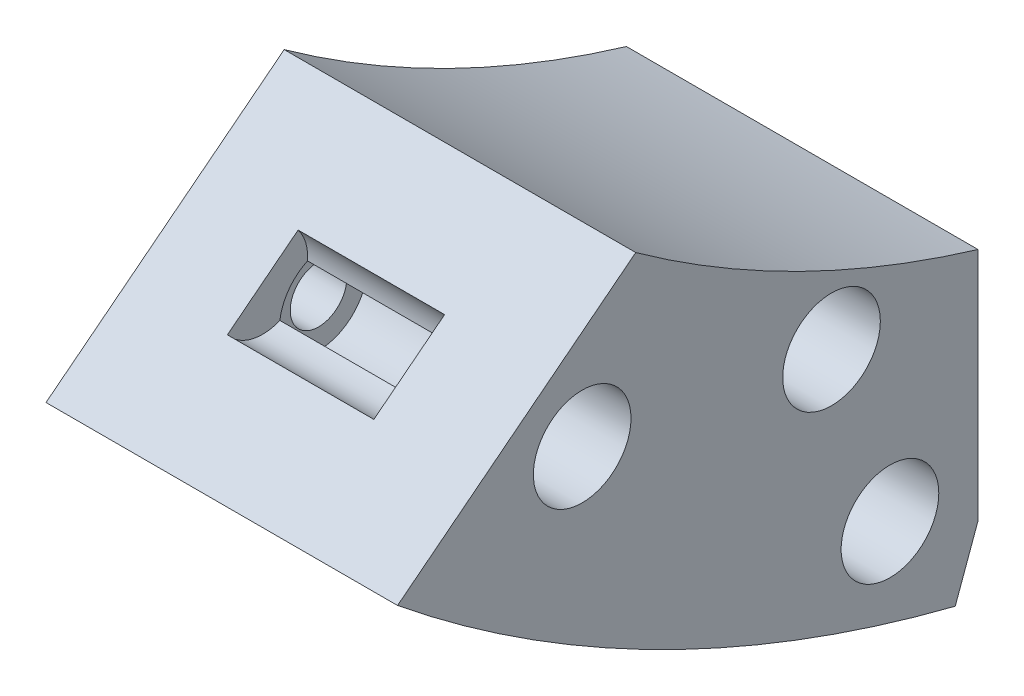
ISO-10303-21;
HEADER;
FILE_DESCRIPTION(('STEP AP214'),'2;1');
FILE_NAME('part.step','',(''),(''),'','','');
FILE_SCHEMA(('AUTOMOTIVE_DESIGN { 1 0 10303 214 1 1 1 1 }'));
ENDSEC;
DATA;
#1=APPLICATION_CONTEXT('core data for automotive mechanical design processes');
#2=APPLICATION_PROTOCOL_DEFINITION('international standard','automotive_design',2000,#1);
#3=PRODUCT_CONTEXT('',#1,'mechanical');
#4=PRODUCT('Part','Part','',(#3));
#5=PRODUCT_RELATED_PRODUCT_CATEGORY('part','',(#4));
#6=PRODUCT_DEFINITION_FORMATION('','',#4);
#7=PRODUCT_DEFINITION_CONTEXT('part definition',#1,'design');
#8=PRODUCT_DEFINITION('design','',#6,#7);
#9=PRODUCT_DEFINITION_SHAPE('','',#8);
#10=(LENGTH_UNIT() NAMED_UNIT(*) SI_UNIT(.MILLI.,.METRE.));
#11=(NAMED_UNIT(*) PLANE_ANGLE_UNIT() SI_UNIT($,.RADIAN.));
#12=(NAMED_UNIT(*) SI_UNIT($,.STERADIAN.) SOLID_ANGLE_UNIT());
#13=UNCERTAINTY_MEASURE_WITH_UNIT(LENGTH_MEASURE(1.E-05),#10,'distance_accuracy_value','');
#14=(GEOMETRIC_REPRESENTATION_CONTEXT(3) GLOBAL_UNCERTAINTY_ASSIGNED_CONTEXT((#13)) GLOBAL_UNIT_ASSIGNED_CONTEXT((#10,
#11,#12)) REPRESENTATION_CONTEXT('',''));
#15=CARTESIAN_POINT('',(0.,0.,0.));
#16=DIRECTION('',(0.,0.,1.));
#17=DIRECTION('',(1.,0.,0.));
#18=AXIS2_PLACEMENT_3D('',#15,#16,#17);
#19=CARTESIAN_POINT('',(12.5,-1.51980484451966,40.6917055770045));
#20=DIRECTION('',(-1.,0.,0.));
#21=DIRECTION('',(0.,0.,1.));
#22=AXIS2_PLACEMENT_3D('',#19,#20,#21);
#23=CYLINDRICAL_SURFACE('',#22,2.3);
#24=DIRECTION('',(1.,0.,0.));
#25=VECTOR('',#24,1.);
#26=CARTESIAN_POINT('',(11.25,-3.64574234379516,39.8139870861578));
#27=LINE('',#26,#25);
#28=CARTESIAN_POINT('',(5.,-3.64574234379516,39.8139870861578));
#29=VERTEX_POINT('',#28);
#30=CARTESIAN_POINT('',(12.5,-3.64574234379516,39.8139870861578));
#31=VERTEX_POINT('',#30);
#32=EDGE_CURVE('E11',#29,#31,#27,.T.);
#33=ORIENTED_EDGE('',*,*,#32,.F.);
#34=CARTESIAN_POINT('',(5.,-1.51980484451966,40.6917055770045));
#35=DIRECTION('',(1.,0.,0.));
#36=DIRECTION('',(0.,0.,-1.));
#37=AXIS2_PLACEMENT_3D('',#34,#35,#36);
#38=CIRCLE('',#37,2.3);
#39=CARTESIAN_POINT('',(5.,-2.93803947495611,42.5023989616035));
#40=VERTEX_POINT('',#39);
#41=EDGE_CURVE('E204',#40,#29,#38,.T.);
#42=ORIENTED_EDGE('',*,*,#41,.F.);
#43=DIRECTION('',(-1.,0.,0.));
#44=VECTOR('',#43,1.);
#45=CARTESIAN_POINT('',(12.5,-2.93803947495611,42.5023989616035));
#46=LINE('',#45,#44);
#47=CARTESIAN_POINT('',(12.5,-2.93803947495611,42.5023989616035));
#48=VERTEX_POINT('',#47);
#49=EDGE_CURVE('E166',#48,#40,#46,.T.);
#50=ORIENTED_EDGE('',*,*,#49,.F.);
#51=CARTESIAN_POINT('',(12.5,-1.51980484451966,40.6917055770045));
#52=DIRECTION('',(1.,0.,0.));
#53=DIRECTION('',(0.,0.,-1.));
#54=AXIS2_PLACEMENT_3D('',#51,#52,#53);
#55=CIRCLE('',#54,2.3);
#56=EDGE_CURVE('E215',#48,#31,#55,.T.);
#57=ORIENTED_EDGE('',*,*,#56,.T.);
#58=EDGE_LOOP('',(#33,#42,#50,#57));
#59=FACE_BOUND('',#58,.T.);
#60=ADVANCED_FACE('F43',(#59),#23,.F.);
#61=CARTESIAN_POINT('',(5.,3.44990452796305,9.47853478985269));
#62=DIRECTION('',(0.,-0.34202014332567,-0.939692620785908));
#63=DIRECTION('',(0.,0.939692620785908,-0.34202014332567));
#64=AXIS2_PLACEMENT_3D('',#61,#62,#63);
#65=PLANE('',#64);
#66=DIRECTION('',(0.,-0.939692620785908,0.34202014332567));
#67=VECTOR('',#66,1.);
#68=CARTESIAN_POINT('',(0.,3.44990452796305,9.47853478985269));
#69=LINE('',#68,#67);
#70=CARTESIAN_POINT('',(0.,-17.4044108827094,17.0688848553364));
#71=VERTEX_POINT('',#70);
#72=CARTESIAN_POINT('',(0.,-20.6071995803838,18.2346046079341));
#73=VERTEX_POINT('',#72);
#74=EDGE_CURVE('E131',#71,#73,#69,.T.);
#75=ORIENTED_EDGE('',*,*,#74,.F.);
#76=DIRECTION('',(-1.,0.,0.));
#77=VECTOR('',#76,1.);
#78=CARTESIAN_POINT('',(18.,-17.4044108827094,17.0688848553364));
#79=LINE('',#78,#77);
#80=CARTESIAN_POINT('',(18.,-17.4044108827094,17.0688848553364));
#81=VERTEX_POINT('',#80);
#82=EDGE_CURVE('E233',#81,#71,#79,.T.);
#83=ORIENTED_EDGE('',*,*,#82,.F.);
#84=DIRECTION('',(0.,0.939692620785908,-0.34202014332567));
#85=VECTOR('',#84,1.);
#86=CARTESIAN_POINT('',(18.,3.44990452796305,9.47853478985269));
#87=LINE('',#86,#85);
#88=CARTESIAN_POINT('',(18.,-20.6071995803838,18.2346046079342));
#89=VERTEX_POINT('',#88);
#90=EDGE_CURVE('E139',#89,#81,#87,.T.);
#91=ORIENTED_EDGE('',*,*,#90,.F.);
#92=DIRECTION('',(-1.,0.,0.));
#93=VECTOR('',#92,1.);
#94=CARTESIAN_POINT('',(5.,-20.6071995803838,18.2346046079341));
#95=LINE('',#94,#93);
#96=EDGE_CURVE('E142',#89,#73,#95,.T.);
#97=ORIENTED_EDGE('',*,*,#96,.T.);
#98=EDGE_LOOP('',(#75,#83,#91,#97));
#99=FACE_BOUND('',#98,.T.);
#100=ADVANCED_FACE('F45',(#99),#65,.T.);
#101=CARTESIAN_POINT('',(5.,51.4204978338215,0.));
#102=DIRECTION('',(-1.,0.,0.));
#103=DIRECTION('',(0.,0.,1.));
#104=AXIS2_PLACEMENT_3D('',#101,#102,#103);
#105=CYLINDRICAL_SURFACE('',#104,59.3);
#106=CARTESIAN_POINT('',(0.,51.4204978338215,0.));
#107=DIRECTION('',(1.,0.,0.));
#108=DIRECTION('',(0.,0.,-1.));
#109=AXIS2_PLACEMENT_3D('',#106,#107,#108);
#110=CIRCLE('',#109,59.3);
#111=CARTESIAN_POINT('',(0.,-5.3698461499516,17.0688848553364));
#112=VERTEX_POINT('',#111);
#113=CARTESIAN_POINT('',(0.,3.25652029388745,34.5936593544646));
#114=VERTEX_POINT('',#113);
#115=EDGE_CURVE('E91',#112,#114,#110,.F.);
#116=ORIENTED_EDGE('',*,*,#115,.T.);
#117=DIRECTION('',(-1.,0.,0.));
#118=VECTOR('',#117,1.);
#119=CARTESIAN_POINT('',(5.,3.25652029388745,34.5936593544646));
#120=LINE('',#119,#118);
#121=CARTESIAN_POINT('',(18.,3.25652029388745,34.5936593544646));
#122=VERTEX_POINT('',#121);
#123=EDGE_CURVE('E159',#122,#114,#120,.T.);
#124=ORIENTED_EDGE('',*,*,#123,.F.);
#125=CARTESIAN_POINT('',(18.,51.4204978338215,0.));
#126=DIRECTION('',(1.,0.,0.));
#127=DIRECTION('',(0.,0.,-1.));
#128=AXIS2_PLACEMENT_3D('',#125,#126,#127);
#129=CIRCLE('',#128,59.3);
#130=CARTESIAN_POINT('',(18.,-5.3698461499516,17.0688848553364));
#131=VERTEX_POINT('',#130);
#132=EDGE_CURVE('E73',#122,#131,#129,.T.);
#133=ORIENTED_EDGE('',*,*,#132,.T.);
#134=DIRECTION('',(-1.,0.,0.));
#135=VECTOR('',#134,1.);
#136=CARTESIAN_POINT('',(18.,-5.3698461499516,17.0688848553364));
#137=LINE('',#136,#135);
#138=EDGE_CURVE('E182',#131,#112,#137,.T.);
#139=ORIENTED_EDGE('',*,*,#138,.T.);
#140=EDGE_LOOP('',(#116,#124,#133,#139));
#141=FACE_BOUND('',#140,.T.);
#142=ADVANCED_FACE('F231',(#141),#105,.F.);
#143=CARTESIAN_POINT('',(5.,18.8115247673315,14.7342206600315));
#144=DIRECTION('',(0.,0.787257993303946,0.616623752363663));
#145=DIRECTION('',(0.,-0.616623752363663,0.787257993303946));
#146=AXIS2_PLACEMENT_3D('',#143,#144,#145);
#147=PLANE('',#146);
#148=DIRECTION('',(0.,0.616623752363663,-0.787257993303946));
#149=VECTOR('',#148,1.);
#150=CARTESIAN_POINT('',(12.5,18.8115247673315,14.7342206600315));
#151=LINE('',#150,#149);
#152=CARTESIAN_POINT('',(12.5,-0.101570214083261,38.8810121924054));
#153=VERTEX_POINT('',#152);
#154=EDGE_CURVE('E174',#48,#153,#151,.T.);
#155=ORIENTED_EDGE('',*,*,#154,.F.);
#156=ORIENTED_EDGE('',*,*,#49,.T.);
#157=DIRECTION('',(0.,0.616623752363663,-0.787257993303946));
#158=VECTOR('',#157,1.);
#159=CARTESIAN_POINT('',(5.,18.8115247673315,14.7342206600315));
#160=LINE('',#159,#158);
#161=CARTESIAN_POINT('',(5.,-0.101570214083261,38.8810121924054));
#162=VERTEX_POINT('',#161);
#163=EDGE_CURVE('E162',#40,#162,#160,.T.);
#164=ORIENTED_EDGE('',*,*,#163,.T.);
#165=DIRECTION('',(-1.,0.,0.));
#166=VECTOR('',#165,1.);
#167=CARTESIAN_POINT('',(12.5,-0.101570214083261,38.8810121924054));
#168=LINE('',#167,#166);
#169=EDGE_CURVE('E170',#162,#153,#168,.F.);
#170=ORIENTED_EDGE('',*,*,#169,.T.);
#171=EDGE_LOOP('',(#155,#156,#164,#170));
#172=FACE_BOUND('',#171,.T.);
#173=DIRECTION('',(0.,0.616623752363663,-0.787257993303946));
#174=VECTOR('',#173,1.);
#175=CARTESIAN_POINT('',(0.,18.8115247673315,14.7342206600315));
#176=LINE('',#175,#174);
#177=CARTESIAN_POINT('',(0.,-6.29612998292682,46.7897517995443));
#178=VERTEX_POINT('',#177);
#179=EDGE_CURVE('E152',#178,#114,#176,.T.);
#180=ORIENTED_EDGE('',*,*,#179,.F.);
#181=DIRECTION('',(-1.,0.,0.));
#182=VECTOR('',#181,1.);
#183=CARTESIAN_POINT('',(5.,-6.29612998292682,46.7897517995443));
#184=LINE('',#183,#182);
#185=CARTESIAN_POINT('',(18.,-6.29612998292677,46.7897517995444));
#186=VERTEX_POINT('',#185);
#187=EDGE_CURVE('E147',#186,#178,#184,.T.);
#188=ORIENTED_EDGE('',*,*,#187,.F.);
#189=DIRECTION('',(0.,-0.616623752363663,0.787257993303946));
#190=VECTOR('',#189,1.);
#191=CARTESIAN_POINT('',(18.,18.8115247673315,14.7342206600315));
#192=LINE('',#191,#190);
#193=EDGE_CURVE('E219',#122,#186,#192,.T.);
#194=ORIENTED_EDGE('',*,*,#193,.F.);
#195=ORIENTED_EDGE('',*,*,#123,.T.);
#196=EDGE_LOOP('',(#180,#188,#194,#195));
#197=FACE_BOUND('',#196,.T.);
#198=ADVANCED_FACE('F230',(#172,#197),#147,.T.);
#199=CARTESIAN_POINT('',(5.,51.4204978338215,0.));
#200=DIRECTION('',(-1.,0.,0.));
#201=DIRECTION('',(0.,0.,1.));
#202=AXIS2_PLACEMENT_3D('',#199,#200,#201);
#203=CYLINDRICAL_SURFACE('',#202,74.3);
#204=CARTESIAN_POINT('',(0.,51.4204978338215,0.));
#205=DIRECTION('',(1.,0.,0.));
#206=DIRECTION('',(0.,0.,-1.));
#207=AXIS2_PLACEMENT_3D('',#204,#205,#206);
#208=CIRCLE('',#207,74.3);
#209=EDGE_CURVE('E135',#73,#178,#208,.F.);
#210=ORIENTED_EDGE('',*,*,#209,.F.);
#211=ORIENTED_EDGE('',*,*,#96,.F.);
#212=CARTESIAN_POINT('',(18.,51.4204978338215,0.));
#213=DIRECTION('',(1.,0.,0.));
#214=DIRECTION('',(0.,0.,-1.));
#215=AXIS2_PLACEMENT_3D('',#212,#213,#214);
#216=CIRCLE('',#215,74.3);
#217=EDGE_CURVE('E223',#186,#89,#216,.T.);
#218=ORIENTED_EDGE('',*,*,#217,.F.);
#219=ORIENTED_EDGE('',*,*,#187,.T.);
#220=EDGE_LOOP('',(#210,#211,#218,#219));
#221=FACE_BOUND('',#220,.T.);
#222=ADVANCED_FACE('F149',(#221),#203,.T.);
#223=CARTESIAN_POINT('',(0.,0.,0.));
#224=DIRECTION('',(1.,0.,0.));
#225=DIRECTION('',(0.,0.,-1.));
#226=AXIS2_PLACEMENT_3D('',#223,#224,#225);
#227=PLANE('',#226);
#228=CARTESIAN_POINT('',(0.,-3.97184686974396,37.3353471691558));
#229=DIRECTION('',(1.,0.,0.));
#230=DIRECTION('',(0.,0.,-1.));
#231=AXIS2_PLACEMENT_3D('',#228,#229,#230);
#232=CIRCLE('',#231,1.45);
#233=CARTESIAN_POINT('',(0.,-3.97184686974396,35.8853471691558));
#234=VERTEX_POINT('',#233);
#235=EDGE_CURVE('E271',#234,#234,#232,.T.);
#236=ORIENTED_EDGE('',*,*,#235,.T.);
#237=EDGE_LOOP('',(#236));
#238=FACE_BOUND('',#237,.T.);
#239=CARTESIAN_POINT('',(0.,-6.04792738355526,24.5688848553364));
#240=DIRECTION('',(1.,0.,0.));
#241=DIRECTION('',(0.,0.,-1.));
#242=AXIS2_PLACEMENT_3D('',#239,#240,#241);
#243=CIRCLE('',#242,1.45);
#244=CARTESIAN_POINT('',(0.,-6.04792738355526,23.1188848553364));
#245=VERTEX_POINT('',#244);
#246=EDGE_CURVE('E254',#245,#245,#243,.T.);
#247=ORIENTED_EDGE('',*,*,#246,.T.);
#248=EDGE_LOOP('',(#247));
#249=FACE_BOUND('',#248,.T.);
#250=CARTESIAN_POINT('',(0.,-15.1710720304473,21.5769048524624));
#251=DIRECTION('',(1.,0.,0.));
#252=DIRECTION('',(0.,0.,-1.));
#253=AXIS2_PLACEMENT_3D('',#250,#251,#252);
#254=CIRCLE('',#253,1.45);
#255=CARTESIAN_POINT('',(0.,-15.1710720304473,20.1269048524624));
#256=VERTEX_POINT('',#255);
#257=EDGE_CURVE('E237',#256,#256,#254,.T.);
#258=ORIENTED_EDGE('',*,*,#257,.T.);
#259=EDGE_LOOP('',(#258));
#260=FACE_BOUND('',#259,.T.);
#261=ORIENTED_EDGE('',*,*,#115,.F.);
#262=DIRECTION('',(0.,1.,0.));
#263=VECTOR('',#262,1.);
#264=CARTESIAN_POINT('',(0.,0.,17.0688848553364));
#265=LINE('',#264,#263);
#266=EDGE_CURVE('E137',#112,#71,#265,.F.);
#267=ORIENTED_EDGE('',*,*,#266,.T.);
#268=ORIENTED_EDGE('',*,*,#74,.T.);
#269=ORIENTED_EDGE('',*,*,#209,.T.);
#270=ORIENTED_EDGE('',*,*,#179,.T.);
#271=EDGE_LOOP('',(#261,#267,#268,#269,#270));
#272=FACE_BOUND('',#271,.T.);
#273=ADVANCED_FACE('F133',(#238,#249,#260,#272),#227,.F.);
#274=CARTESIAN_POINT('',(18.,0.,0.));
#275=DIRECTION('',(1.,0.,0.));
#276=DIRECTION('',(0.,0.,-1.));
#277=AXIS2_PLACEMENT_3D('',#274,#275,#276);
#278=PLANE('',#277);
#279=CARTESIAN_POINT('',(18.,-3.97184686974396,37.3353471691558));
#280=DIRECTION('',(1.,0.,0.));
#281=DIRECTION('',(0.,0.,-1.));
#282=AXIS2_PLACEMENT_3D('',#279,#280,#281);
#283=CIRCLE('',#282,2.5);
#284=CARTESIAN_POINT('',(18.,-3.97184686974396,34.8353471691558));
#285=VERTEX_POINT('',#284);
#286=EDGE_CURVE('E283',#285,#285,#283,.T.);
#287=ORIENTED_EDGE('',*,*,#286,.F.);
#288=EDGE_LOOP('',(#287));
#289=FACE_BOUND('',#288,.T.);
#290=CARTESIAN_POINT('',(18.,-6.04792738355526,24.5688848553364));
#291=DIRECTION('',(1.,0.,0.));
#292=DIRECTION('',(0.,0.,-1.));
#293=AXIS2_PLACEMENT_3D('',#290,#291,#292);
#294=CIRCLE('',#293,2.5);
#295=CARTESIAN_POINT('',(18.,-6.04792738355526,22.0688848553364));
#296=VERTEX_POINT('',#295);
#297=EDGE_CURVE('E206',#296,#296,#294,.T.);
#298=ORIENTED_EDGE('',*,*,#297,.F.);
#299=EDGE_LOOP('',(#298));
#300=FACE_BOUND('',#299,.T.);
#301=CARTESIAN_POINT('',(18.,-15.1710720304473,21.5769048524624));
#302=DIRECTION('',(1.,0.,0.));
#303=DIRECTION('',(0.,0.,-1.));
#304=AXIS2_PLACEMENT_3D('',#301,#302,#303);
#305=CIRCLE('',#304,2.5);
#306=CARTESIAN_POINT('',(18.,-15.1710720304473,19.0769048524624));
#307=VERTEX_POINT('',#306);
#308=EDGE_CURVE('E251',#307,#307,#305,.T.);
#309=ORIENTED_EDGE('',*,*,#308,.F.);
#310=EDGE_LOOP('',(#309));
#311=FACE_BOUND('',#310,.T.);
#312=DIRECTION('',(0.,-1.,0.));
#313=VECTOR('',#312,1.);
#314=CARTESIAN_POINT('',(18.,0.,17.0688848553364));
#315=LINE('',#314,#313);
#316=EDGE_CURVE('E97',#131,#81,#315,.T.);
#317=ORIENTED_EDGE('',*,*,#316,.F.);
#318=ORIENTED_EDGE('',*,*,#132,.F.);
#319=ORIENTED_EDGE('',*,*,#193,.T.);
#320=ORIENTED_EDGE('',*,*,#217,.T.);
#321=ORIENTED_EDGE('',*,*,#90,.T.);
#322=EDGE_LOOP('',(#317,#318,#319,#320,#321));
#323=FACE_BOUND('',#322,.T.);
#324=ADVANCED_FACE('F227',(#289,#300,#311,#323),#278,.T.);
#325=DIRECTION('',(1.,0.,0.));
#326=VECTOR('',#325,1.);
#327=CARTESIAN_POINT('',(11.25,-1.70966629971349,38.3995553577056));
#328=LINE('',#327,#326);
#329=CARTESIAN_POINT('',(12.5,-1.70966629971349,38.3995553577056));
#330=VERTEX_POINT('',#329);
#331=CARTESIAN_POINT('',(5.,-1.70966629971349,38.3995553577056));
#332=VERTEX_POINT('',#331);
#333=EDGE_CURVE('E52',#330,#332,#328,.F.);
#334=ORIENTED_EDGE('',*,*,#333,.F.);
#335=EDGE_CURVE('E212',#330,#153,#55,.T.);
#336=ORIENTED_EDGE('',*,*,#335,.T.);
#337=ORIENTED_EDGE('',*,*,#169,.F.);
#338=EDGE_CURVE('E181',#332,#162,#38,.T.);
#339=ORIENTED_EDGE('',*,*,#338,.F.);
#340=EDGE_LOOP('',(#334,#336,#337,#339));
#341=FACE_BOUND('',#340,.T.);
#342=ADVANCED_FACE('F208',(#341),#23,.F.);
#343=CARTESIAN_POINT('',(12.5,-1.51980484451966,40.6917055770045));
#344=DIRECTION('',(1.,0.,0.));
#345=DIRECTION('',(0.,0.,-1.));
#346=AXIS2_PLACEMENT_3D('',#343,#344,#345);
#347=PLANE('',#346);
#348=ORIENTED_EDGE('',*,*,#335,.F.);
#349=CARTESIAN_POINT('',(12.5,-3.97184686974396,37.3353471691558));
#350=DIRECTION('',(1.,0.,0.));
#351=DIRECTION('',(0.,0.,-1.));
#352=AXIS2_PLACEMENT_3D('',#349,#350,#351);
#353=CIRCLE('',#352,2.5);
#354=EDGE_CURVE('E61',#330,#31,#353,.T.);
#355=ORIENTED_EDGE('',*,*,#354,.T.);
#356=ORIENTED_EDGE('',*,*,#56,.F.);
#357=ORIENTED_EDGE('',*,*,#154,.T.);
#358=EDGE_LOOP('',(#348,#355,#356,#357));
#359=FACE_BOUND('',#358,.T.);
#360=ADVANCED_FACE('F320',(#359),#347,.F.);
#361=CARTESIAN_POINT('',(5.,-1.51980484451966,40.6917055770045));
#362=DIRECTION('',(1.,0.,0.));
#363=DIRECTION('',(0.,0.,-1.));
#364=AXIS2_PLACEMENT_3D('',#361,#362,#363);
#365=PLANE('',#364);
#366=CARTESIAN_POINT('',(5.,-3.97184686974396,37.3353471691558));
#367=DIRECTION('',(1.,0.,0.));
#368=DIRECTION('',(0.,0.,-1.));
#369=AXIS2_PLACEMENT_3D('',#366,#367,#368);
#370=CIRCLE('',#369,2.5);
#371=EDGE_CURVE('E191',#332,#29,#370,.T.);
#372=ORIENTED_EDGE('',*,*,#371,.F.);
#373=ORIENTED_EDGE('',*,*,#338,.T.);
#374=ORIENTED_EDGE('',*,*,#163,.F.);
#375=ORIENTED_EDGE('',*,*,#41,.T.);
#376=EDGE_LOOP('',(#372,#373,#374,#375));
#377=FACE_BOUND('',#376,.T.);
#378=ADVANCED_FACE('F201',(#377),#365,.T.);
#379=CARTESIAN_POINT('',(18.,0.,17.0688848553364));
#380=DIRECTION('',(0.,0.,-1.));
#381=DIRECTION('',(0.,1.,0.));
#382=AXIS2_PLACEMENT_3D('',#379,#380,#381);
#383=PLANE('',#382);
#384=ORIENTED_EDGE('',*,*,#266,.F.);
#385=ORIENTED_EDGE('',*,*,#138,.F.);
#386=ORIENTED_EDGE('',*,*,#316,.T.);
#387=ORIENTED_EDGE('',*,*,#82,.T.);
#388=EDGE_LOOP('',(#384,#385,#386,#387));
#389=FACE_BOUND('',#388,.T.);
#390=ADVANCED_FACE('F235',(#389),#383,.T.);
#391=CARTESIAN_POINT('',(18.,-15.1710720304473,21.5769048524624));
#392=DIRECTION('',(1.,0.,0.));
#393=DIRECTION('',(0.,0.,-1.));
#394=AXIS2_PLACEMENT_3D('',#391,#392,#393);
#395=CYLINDRICAL_SURFACE('',#394,1.45);
#396=ORIENTED_EDGE('',*,*,#257,.F.);
#397=EDGE_LOOP('',(#396));
#398=FACE_BOUND('',#397,.T.);
#399=CARTESIAN_POINT('',(4.5,-15.1710720304473,21.5769048524624));
#400=DIRECTION('',(1.,0.,0.));
#401=DIRECTION('',(0.,0.,-1.));
#402=AXIS2_PLACEMENT_3D('',#399,#400,#401);
#403=CIRCLE('',#402,1.45);
#404=CARTESIAN_POINT('',(4.5,-15.1710720304473,20.1269048524624));
#405=VERTEX_POINT('',#404);
#406=EDGE_CURVE('E243',#405,#405,#403,.T.);
#407=ORIENTED_EDGE('',*,*,#406,.T.);
#408=EDGE_LOOP('',(#407));
#409=FACE_BOUND('',#408,.T.);
#410=ADVANCED_FACE('F308',(#398,#409),#395,.F.);
#411=CARTESIAN_POINT('',(4.5,-13.7210720304473,21.5769048524624));
#412=DIRECTION('',(-1.,0.,0.));
#413=DIRECTION('',(0.,0.,1.));
#414=AXIS2_PLACEMENT_3D('',#411,#412,#413);
#415=PLANE('',#414);
#416=ORIENTED_EDGE('',*,*,#406,.F.);
#417=EDGE_LOOP('',(#416));
#418=FACE_BOUND('',#417,.T.);
#419=CARTESIAN_POINT('',(4.5,-15.1710720304473,21.5769048524624));
#420=DIRECTION('',(1.,0.,0.));
#421=DIRECTION('',(0.,0.,-1.));
#422=AXIS2_PLACEMENT_3D('',#419,#420,#421);
#423=CIRCLE('',#422,2.5);
#424=CARTESIAN_POINT('',(4.5,-15.1710720304473,19.0769048524624));
#425=VERTEX_POINT('',#424);
#426=EDGE_CURVE('E247',#425,#425,#423,.T.);
#427=ORIENTED_EDGE('',*,*,#426,.T.);
#428=EDGE_LOOP('',(#427));
#429=FACE_BOUND('',#428,.T.);
#430=ADVANCED_FACE('F298',(#418,#429),#415,.F.);
#431=CARTESIAN_POINT('',(18.,-15.1710720304473,21.5769048524624));
#432=DIRECTION('',(1.,0.,0.));
#433=DIRECTION('',(0.,0.,-1.));
#434=AXIS2_PLACEMENT_3D('',#431,#432,#433);
#435=CYLINDRICAL_SURFACE('',#434,2.5);
#436=ORIENTED_EDGE('',*,*,#426,.F.);
#437=EDGE_LOOP('',(#436));
#438=FACE_BOUND('',#437,.T.);
#439=ORIENTED_EDGE('',*,*,#308,.T.);
#440=EDGE_LOOP('',(#439));
#441=FACE_BOUND('',#440,.T.);
#442=ADVANCED_FACE('F295',(#438,#441),#435,.F.);
#443=CARTESIAN_POINT('',(18.,-6.04792738355526,24.5688848553364));
#444=DIRECTION('',(1.,0.,0.));
#445=DIRECTION('',(0.,0.,-1.));
#446=AXIS2_PLACEMENT_3D('',#443,#444,#445);
#447=CYLINDRICAL_SURFACE('',#446,1.45);
#448=ORIENTED_EDGE('',*,*,#246,.F.);
#449=EDGE_LOOP('',(#448));
#450=FACE_BOUND('',#449,.T.);
#451=CARTESIAN_POINT('',(4.5,-6.04792738355526,24.5688848553364));
#452=DIRECTION('',(1.,0.,0.));
#453=DIRECTION('',(0.,0.,-1.));
#454=AXIS2_PLACEMENT_3D('',#451,#452,#453);
#455=CIRCLE('',#454,1.45);
#456=CARTESIAN_POINT('',(4.5,-6.04792738355526,23.1188848553364));
#457=VERTEX_POINT('',#456);
#458=EDGE_CURVE('E258',#457,#457,#455,.T.);
#459=ORIENTED_EDGE('',*,*,#458,.T.);
#460=EDGE_LOOP('',(#459));
#461=FACE_BOUND('',#460,.T.);
#462=ADVANCED_FACE('F297',(#450,#461),#447,.F.);
#463=CARTESIAN_POINT('',(4.5,-4.59792738355526,24.5688848553364));
#464=DIRECTION('',(-1.,0.,0.));
#465=DIRECTION('',(0.,0.,1.));
#466=AXIS2_PLACEMENT_3D('',#463,#464,#465);
#467=PLANE('',#466);
#468=ORIENTED_EDGE('',*,*,#458,.F.);
#469=EDGE_LOOP('',(#468));
#470=FACE_BOUND('',#469,.T.);
#471=CARTESIAN_POINT('',(4.5,-6.04792738355526,24.5688848553364));
#472=DIRECTION('',(1.,0.,0.));
#473=DIRECTION('',(0.,0.,-1.));
#474=AXIS2_PLACEMENT_3D('',#471,#472,#473);
#475=CIRCLE('',#474,2.5);
#476=CARTESIAN_POINT('',(4.5,-6.04792738355526,22.0688848553364));
#477=VERTEX_POINT('',#476);
#478=EDGE_CURVE('E262',#477,#477,#475,.T.);
#479=ORIENTED_EDGE('',*,*,#478,.T.);
#480=EDGE_LOOP('',(#479));
#481=FACE_BOUND('',#480,.T.);
#482=ADVANCED_FACE('F305',(#470,#481),#467,.F.);
#483=CARTESIAN_POINT('',(18.,-6.04792738355526,24.5688848553364));
#484=DIRECTION('',(1.,0.,0.));
#485=DIRECTION('',(0.,0.,-1.));
#486=AXIS2_PLACEMENT_3D('',#483,#484,#485);
#487=CYLINDRICAL_SURFACE('',#486,2.5);
#488=ORIENTED_EDGE('',*,*,#478,.F.);
#489=EDGE_LOOP('',(#488));
#490=FACE_BOUND('',#489,.T.);
#491=ORIENTED_EDGE('',*,*,#297,.T.);
#492=EDGE_LOOP('',(#491));
#493=FACE_BOUND('',#492,.T.);
#494=ADVANCED_FACE('F389',(#490,#493),#487,.F.);
#495=CARTESIAN_POINT('',(18.,-3.97184686974396,37.3353471691558));
#496=DIRECTION('',(1.,0.,0.));
#497=DIRECTION('',(0.,0.,-1.));
#498=AXIS2_PLACEMENT_3D('',#495,#496,#497);
#499=CYLINDRICAL_SURFACE('',#498,1.45);
#500=ORIENTED_EDGE('',*,*,#235,.F.);
#501=EDGE_LOOP('',(#500));
#502=FACE_BOUND('',#501,.T.);
#503=CARTESIAN_POINT('',(4.5,-3.97184686974396,37.3353471691558));
#504=DIRECTION('',(1.,0.,0.));
#505=DIRECTION('',(0.,0.,-1.));
#506=AXIS2_PLACEMENT_3D('',#503,#504,#505);
#507=CIRCLE('',#506,1.45);
#508=CARTESIAN_POINT('',(4.5,-3.97184686974396,35.8853471691558));
#509=VERTEX_POINT('',#508);
#510=EDGE_CURVE('E275',#509,#509,#507,.T.);
#511=ORIENTED_EDGE('',*,*,#510,.T.);
#512=EDGE_LOOP('',(#511));
#513=FACE_BOUND('',#512,.T.);
#514=ADVANCED_FACE('F381',(#502,#513),#499,.F.);
#515=CARTESIAN_POINT('',(4.5,-2.52184686974396,37.3353471691558));
#516=DIRECTION('',(-1.,0.,0.));
#517=DIRECTION('',(0.,0.,1.));
#518=AXIS2_PLACEMENT_3D('',#515,#516,#517);
#519=PLANE('',#518);
#520=ORIENTED_EDGE('',*,*,#510,.F.);
#521=EDGE_LOOP('',(#520));
#522=FACE_BOUND('',#521,.T.);
#523=CARTESIAN_POINT('',(4.5,-3.97184686974396,37.3353471691558));
#524=DIRECTION('',(1.,0.,0.));
#525=DIRECTION('',(0.,0.,-1.));
#526=AXIS2_PLACEMENT_3D('',#523,#524,#525);
#527=CIRCLE('',#526,2.5);
#528=CARTESIAN_POINT('',(4.5,-3.97184686974396,34.8353471691558));
#529=VERTEX_POINT('',#528);
#530=EDGE_CURVE('E279',#529,#529,#527,.T.);
#531=ORIENTED_EDGE('',*,*,#530,.T.);
#532=EDGE_LOOP('',(#531));
#533=FACE_BOUND('',#532,.T.);
#534=ADVANCED_FACE('F372',(#522,#533),#519,.F.);
#535=CARTESIAN_POINT('',(18.,-3.97184686974396,37.3353471691558));
#536=DIRECTION('',(1.,0.,0.));
#537=DIRECTION('',(0.,0.,-1.));
#538=AXIS2_PLACEMENT_3D('',#535,#536,#537);
#539=CYLINDRICAL_SURFACE('',#538,2.5);
#540=ORIENTED_EDGE('',*,*,#32,.T.);
#541=ORIENTED_EDGE('',*,*,#354,.F.);
#542=ORIENTED_EDGE('',*,*,#333,.T.);
#543=ORIENTED_EDGE('',*,*,#371,.T.);
#544=EDGE_LOOP('',(#540,#541,#542,#543));
#545=FACE_BOUND('',#544,.T.);
#546=ORIENTED_EDGE('',*,*,#530,.F.);
#547=EDGE_LOOP('',(#546));
#548=FACE_BOUND('',#547,.T.);
#549=ORIENTED_EDGE('',*,*,#286,.T.);
#550=EDGE_LOOP('',(#549));
#551=FACE_BOUND('',#550,.T.);
#552=ADVANCED_FACE('F189',(#545,#548,#551),#539,.F.);
#553=CLOSED_SHELL('',(#60,#100,#142,#198,#222,#273,#324,#342,#360,#378,#390,#410,#430,#442,#462,
#482,#494,#514,#534,#552));
#554=MANIFOLD_SOLID_BREP('B2',#553);
#555=ADVANCED_BREP_SHAPE_REPRESENTATION('',(#18,#554),#14);
#556=SHAPE_DEFINITION_REPRESENTATION(#9,#555);
ENDSEC;
END-ISO-10303-21;
